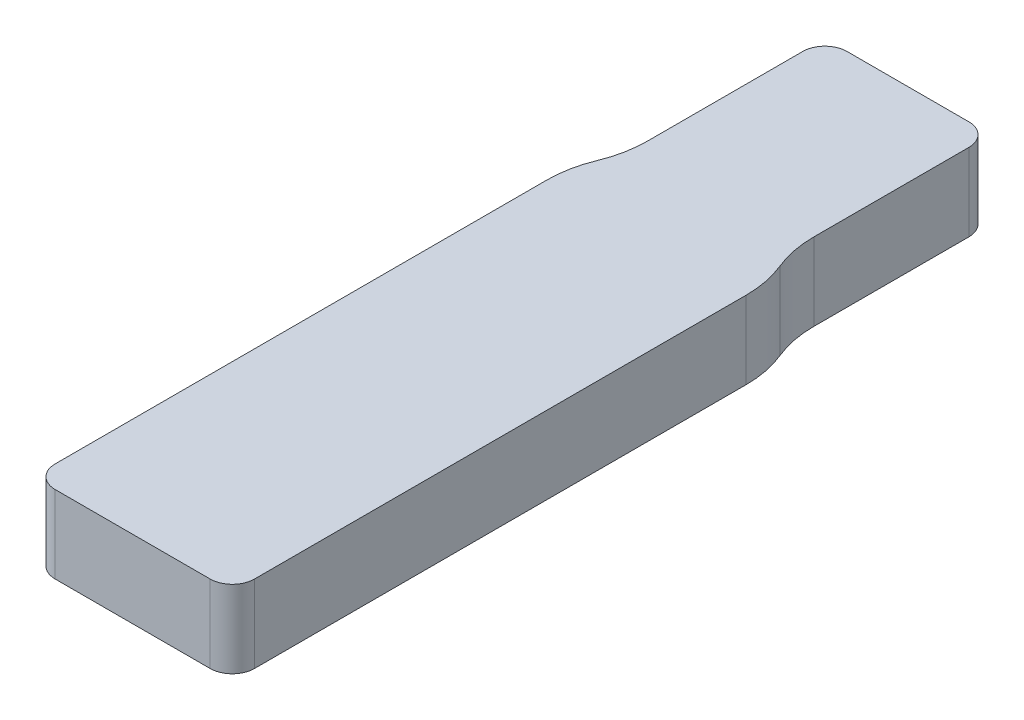
ISO-10303-21;
HEADER;
FILE_DESCRIPTION(('STEP AP214'),'2;1');
FILE_NAME('part.step','',(''),(''),'','','');
FILE_SCHEMA(('AUTOMOTIVE_DESIGN { 1 0 10303 214 1 1 1 1 }'));
ENDSEC;
DATA;
#1=APPLICATION_CONTEXT('core data for automotive mechanical design processes');
#2=APPLICATION_PROTOCOL_DEFINITION('international standard','automotive_design',2000,#1);
#3=PRODUCT_CONTEXT('',#1,'mechanical');
#4=PRODUCT('Part','Part','',(#3));
#5=PRODUCT_RELATED_PRODUCT_CATEGORY('part','',(#4));
#6=PRODUCT_DEFINITION_FORMATION('','',#4);
#7=PRODUCT_DEFINITION_CONTEXT('part definition',#1,'design');
#8=PRODUCT_DEFINITION('design','',#6,#7);
#9=PRODUCT_DEFINITION_SHAPE('','',#8);
#10=(LENGTH_UNIT() NAMED_UNIT(*) SI_UNIT(.MILLI.,.METRE.));
#11=(NAMED_UNIT(*) PLANE_ANGLE_UNIT() SI_UNIT($,.RADIAN.));
#12=(NAMED_UNIT(*) SI_UNIT($,.STERADIAN.) SOLID_ANGLE_UNIT());
#13=UNCERTAINTY_MEASURE_WITH_UNIT(LENGTH_MEASURE(1.E-05),#10,'distance_accuracy_value','');
#14=(GEOMETRIC_REPRESENTATION_CONTEXT(3) GLOBAL_UNCERTAINTY_ASSIGNED_CONTEXT((#13)) GLOBAL_UNIT_ASSIGNED_CONTEXT((#10,
#11,#12)) REPRESENTATION_CONTEXT('',''));
#15=CARTESIAN_POINT('',(0.,0.,0.));
#16=DIRECTION('',(0.,0.,1.));
#17=DIRECTION('',(1.,0.,0.));
#18=AXIS2_PLACEMENT_3D('',#15,#16,#17);
#19=CARTESIAN_POINT('',(0.,7.,0.));
#20=DIRECTION('',(0.,0.,-1.));
#21=DIRECTION('',(-1.,0.,0.));
#22=AXIS2_PLACEMENT_3D('',#19,#20,#21);
#23=PLANE('',#22);
#24=DIRECTION('',(1.,0.,0.));
#25=VECTOR('',#24,1.);
#26=CARTESIAN_POINT('',(0.,0.,0.));
#27=LINE('',#26,#25);
#28=CARTESIAN_POINT('',(-7.,0.,0.));
#29=VERTEX_POINT('',#28);
#30=CARTESIAN_POINT('',(7.,0.,0.));
#31=VERTEX_POINT('',#30);
#32=EDGE_CURVE('E104',#29,#31,#27,.T.);
#33=ORIENTED_EDGE('',*,*,#32,.T.);
#34=DIRECTION('',(0.,-1.,0.));
#35=VECTOR('',#34,1.);
#36=CARTESIAN_POINT('',(7.,7.,0.));
#37=LINE('',#36,#35);
#38=CARTESIAN_POINT('',(7.,7.,0.));
#39=VERTEX_POINT('',#38);
#40=EDGE_CURVE('E11',#39,#31,#37,.T.);
#41=ORIENTED_EDGE('',*,*,#40,.F.);
#42=DIRECTION('',(1.,0.,0.));
#43=VECTOR('',#42,1.);
#44=CARTESIAN_POINT('',(0.,7.,0.));
#45=LINE('',#44,#43);
#46=CARTESIAN_POINT('',(-7.,7.,0.));
#47=VERTEX_POINT('',#46);
#48=EDGE_CURVE('E110',#47,#39,#45,.T.);
#49=ORIENTED_EDGE('',*,*,#48,.F.);
#50=DIRECTION('',(0.,-1.,0.));
#51=VECTOR('',#50,1.);
#52=CARTESIAN_POINT('',(-7.,7.,0.));
#53=LINE('',#52,#51);
#54=EDGE_CURVE('E162',#47,#29,#53,.T.);
#55=ORIENTED_EDGE('',*,*,#54,.T.);
#56=EDGE_LOOP('',(#33,#41,#49,#55));
#57=FACE_BOUND('',#56,.T.);
#58=ADVANCED_FACE('F34',(#57),#23,.F.);
#59=CARTESIAN_POINT('',(7.,7.,-2.));
#60=DIRECTION('',(0.,-1.,0.));
#61=DIRECTION('',(0.,0.,-1.));
#62=AXIS2_PLACEMENT_3D('',#59,#60,#61);
#63=CYLINDRICAL_SURFACE('',#62,2.);
#64=CARTESIAN_POINT('',(7.,0.,-2.));
#65=DIRECTION('',(0.,1.,0.));
#66=DIRECTION('',(0.,0.,1.));
#67=AXIS2_PLACEMENT_3D('',#64,#65,#66);
#68=CIRCLE('',#67,2.);
#69=CARTESIAN_POINT('',(9.,0.,-2.));
#70=VERTEX_POINT('',#69);
#71=EDGE_CURVE('E167',#31,#70,#68,.T.);
#72=ORIENTED_EDGE('',*,*,#71,.T.);
#73=DIRECTION('',(0.,-1.,0.));
#74=VECTOR('',#73,1.);
#75=CARTESIAN_POINT('',(9.,7.,-2.));
#76=LINE('',#75,#74);
#77=CARTESIAN_POINT('',(9.,7.,-2.));
#78=VERTEX_POINT('',#77);
#79=EDGE_CURVE('E42',#78,#70,#76,.T.);
#80=ORIENTED_EDGE('',*,*,#79,.F.);
#81=CARTESIAN_POINT('',(7.,7.,-2.));
#82=DIRECTION('',(0.,1.,0.));
#83=DIRECTION('',(0.,0.,1.));
#84=AXIS2_PLACEMENT_3D('',#81,#82,#83);
#85=CIRCLE('',#84,2.);
#86=EDGE_CURVE('E270',#39,#78,#85,.T.);
#87=ORIENTED_EDGE('',*,*,#86,.F.);
#88=ORIENTED_EDGE('',*,*,#40,.T.);
#89=EDGE_LOOP('',(#72,#80,#87,#88));
#90=FACE_BOUND('',#89,.T.);
#91=ADVANCED_FACE('F273',(#90),#63,.T.);
#92=CARTESIAN_POINT('',(9.,7.,-2.));
#93=DIRECTION('',(-1.,0.,0.));
#94=DIRECTION('',(0.,0.,1.));
#95=AXIS2_PLACEMENT_3D('',#92,#93,#94);
#96=PLANE('',#95);
#97=DIRECTION('',(0.,0.,-1.));
#98=VECTOR('',#97,1.);
#99=CARTESIAN_POINT('',(9.,0.,-2.));
#100=LINE('',#99,#98);
#101=CARTESIAN_POINT('',(9.,0.,-46.39280404));
#102=VERTEX_POINT('',#101);
#103=EDGE_CURVE('E169',#70,#102,#100,.T.);
#104=ORIENTED_EDGE('',*,*,#103,.T.);
#105=DIRECTION('',(0.,-1.,0.));
#106=VECTOR('',#105,1.);
#107=CARTESIAN_POINT('',(9.,7.,-46.39280404));
#108=LINE('',#107,#106);
#109=CARTESIAN_POINT('',(9.,7.,-46.39280404));
#110=VERTEX_POINT('',#109);
#111=EDGE_CURVE('E217',#110,#102,#108,.T.);
#112=ORIENTED_EDGE('',*,*,#111,.F.);
#113=DIRECTION('',(0.,0.,-1.));
#114=VECTOR('',#113,1.);
#115=CARTESIAN_POINT('',(9.,7.,-2.));
#116=LINE('',#115,#114);
#117=EDGE_CURVE('E226',#78,#110,#116,.T.);
#118=ORIENTED_EDGE('',*,*,#117,.F.);
#119=ORIENTED_EDGE('',*,*,#79,.T.);
#120=EDGE_LOOP('',(#104,#112,#118,#119));
#121=FACE_BOUND('',#120,.T.);
#122=ADVANCED_FACE('F224',(#121),#96,.F.);
#123=CARTESIAN_POINT('',(-1.,7.,-46.3928040399999));
#124=DIRECTION('',(0.,-1.,0.));
#125=DIRECTION('',(0.,0.,-1.));
#126=AXIS2_PLACEMENT_3D('',#123,#124,#125);
#127=CYLINDRICAL_SURFACE('',#126,10.);
#128=CARTESIAN_POINT('',(-1.,0.,-46.3928040399999));
#129=DIRECTION('',(0.,1.,0.));
#130=DIRECTION('',(0.,0.,1.));
#131=AXIS2_PLACEMENT_3D('',#128,#129,#130);
#132=CIRCLE('',#131,10.);
#133=CARTESIAN_POINT('',(8.25148991357196,0.,-50.1888459758952));
#134=VERTEX_POINT('',#133);
#135=EDGE_CURVE('E171',#102,#134,#132,.T.);
#136=ORIENTED_EDGE('',*,*,#135,.T.);
#137=DIRECTION('',(0.,-1.,0.));
#138=VECTOR('',#137,1.);
#139=CARTESIAN_POINT('',(8.25148991357196,7.,-50.1888459758952));
#140=LINE('',#139,#138);
#141=CARTESIAN_POINT('',(8.25148991357196,7.,-50.1888459758952));
#142=VERTEX_POINT('',#141);
#143=EDGE_CURVE('E214',#142,#134,#140,.T.);
#144=ORIENTED_EDGE('',*,*,#143,.F.);
#145=CARTESIAN_POINT('',(-1.,7.,-46.3928040399999));
#146=DIRECTION('',(0.,1.,0.));
#147=DIRECTION('',(0.,0.,1.));
#148=AXIS2_PLACEMENT_3D('',#145,#146,#147);
#149=CIRCLE('',#148,10.);
#150=EDGE_CURVE('E244',#110,#142,#149,.T.);
#151=ORIENTED_EDGE('',*,*,#150,.F.);
#152=ORIENTED_EDGE('',*,*,#111,.T.);
#153=EDGE_LOOP('',(#136,#144,#151,#152));
#154=FACE_BOUND('',#153,.T.);
#155=ADVANCED_FACE('F235',(#154),#127,.T.);
#156=CARTESIAN_POINT('',(17.539810113425,7.,-53.999999997794));
#157=DIRECTION('',(0.,-1.,0.));
#158=DIRECTION('',(0.,0.,-1.));
#159=AXIS2_PLACEMENT_3D('',#156,#157,#158);
#160=CYLINDRICAL_SURFACE('',#159,10.0398101134251);
#161=CARTESIAN_POINT('',(17.539810113425,0.,-53.999999997794));
#162=DIRECTION('',(0.,-1.,0.));
#163=DIRECTION('',(0.,0.,1.));
#164=AXIS2_PLACEMENT_3D('',#161,#162,#163);
#165=CIRCLE('',#164,10.0398101134251);
#166=CARTESIAN_POINT('',(7.49999999999988,0.,-53.9999999977944));
#167=VERTEX_POINT('',#166);
#168=EDGE_CURVE('E173',#134,#167,#165,.T.);
#169=ORIENTED_EDGE('',*,*,#168,.T.);
#170=DIRECTION('',(0.,-1.,0.));
#171=VECTOR('',#170,1.);
#172=CARTESIAN_POINT('',(7.49999999999988,7.,-53.9999999977944));
#173=LINE('',#172,#171);
#174=CARTESIAN_POINT('',(7.49999999999988,7.,-53.9999999977944));
#175=VERTEX_POINT('',#174);
#176=EDGE_CURVE('E211',#175,#167,#173,.T.);
#177=ORIENTED_EDGE('',*,*,#176,.F.);
#178=CARTESIAN_POINT('',(17.539810113425,7.,-53.999999997794));
#179=DIRECTION('',(0.,-1.,0.));
#180=DIRECTION('',(0.,0.,1.));
#181=AXIS2_PLACEMENT_3D('',#178,#179,#180);
#182=CIRCLE('',#181,10.0398101134251);
#183=EDGE_CURVE('E241',#142,#175,#182,.T.);
#184=ORIENTED_EDGE('',*,*,#183,.F.);
#185=ORIENTED_EDGE('',*,*,#143,.T.);
#186=EDGE_LOOP('',(#169,#177,#184,#185));
#187=FACE_BOUND('',#186,.T.);
#188=ADVANCED_FACE('F239',(#187),#160,.F.);
#189=CARTESIAN_POINT('',(7.49999999999988,7.,-67.9999999977944));
#190=DIRECTION('',(-1.,0.,0.));
#191=DIRECTION('',(0.,0.,1.));
#192=AXIS2_PLACEMENT_3D('',#189,#190,#191);
#193=PLANE('',#192);
#194=DIRECTION('',(0.,0.,-1.));
#195=VECTOR('',#194,1.);
#196=CARTESIAN_POINT('',(7.49999999999988,0.,-67.9999999977944));
#197=LINE('',#196,#195);
#198=CARTESIAN_POINT('',(7.49999999999988,0.,-67.9999999977944));
#199=VERTEX_POINT('',#198);
#200=EDGE_CURVE('E175',#167,#199,#197,.T.);
#201=ORIENTED_EDGE('',*,*,#200,.T.);
#202=DIRECTION('',(0.,-1.,0.));
#203=VECTOR('',#202,1.);
#204=CARTESIAN_POINT('',(7.49999999999988,7.,-67.9999999977944));
#205=LINE('',#204,#203);
#206=CARTESIAN_POINT('',(7.49999999999988,7.,-67.9999999977944));
#207=VERTEX_POINT('',#206);
#208=EDGE_CURVE('E208',#207,#199,#205,.T.);
#209=ORIENTED_EDGE('',*,*,#208,.F.);
#210=DIRECTION('',(0.,0.,-1.));
#211=VECTOR('',#210,1.);
#212=CARTESIAN_POINT('',(7.49999999999988,7.,-67.9999999977944));
#213=LINE('',#212,#211);
#214=EDGE_CURVE('E243',#175,#207,#213,.T.);
#215=ORIENTED_EDGE('',*,*,#214,.F.);
#216=ORIENTED_EDGE('',*,*,#176,.T.);
#217=EDGE_LOOP('',(#201,#209,#215,#216));
#218=FACE_BOUND('',#217,.T.);
#219=ADVANCED_FACE('F285',(#218),#193,.F.);
#220=CARTESIAN_POINT('',(5.49999999999988,7.,-67.9999999977944));
#221=DIRECTION('',(0.,-1.,0.));
#222=DIRECTION('',(0.,0.,-1.));
#223=AXIS2_PLACEMENT_3D('',#220,#221,#222);
#224=CYLINDRICAL_SURFACE('',#223,2.);
#225=CARTESIAN_POINT('',(5.49999999999988,0.,-67.9999999977944));
#226=DIRECTION('',(0.,1.,0.));
#227=DIRECTION('',(0.,0.,1.));
#228=AXIS2_PLACEMENT_3D('',#225,#226,#227);
#229=CIRCLE('',#228,2.);
#230=CARTESIAN_POINT('',(5.49999999999988,0.,-69.9999999977944));
#231=VERTEX_POINT('',#230);
#232=EDGE_CURVE('E177',#199,#231,#229,.T.);
#233=ORIENTED_EDGE('',*,*,#232,.T.);
#234=DIRECTION('',(0.,-1.,0.));
#235=VECTOR('',#234,1.);
#236=CARTESIAN_POINT('',(5.49999999999988,7.,-69.9999999977944));
#237=LINE('',#236,#235);
#238=CARTESIAN_POINT('',(5.49999999999988,7.,-69.9999999977944));
#239=VERTEX_POINT('',#238);
#240=EDGE_CURVE('E205',#239,#231,#237,.T.);
#241=ORIENTED_EDGE('',*,*,#240,.F.);
#242=CARTESIAN_POINT('',(5.49999999999988,7.,-67.9999999977944));
#243=DIRECTION('',(0.,1.,0.));
#244=DIRECTION('',(0.,0.,1.));
#245=AXIS2_PLACEMENT_3D('',#242,#243,#244);
#246=CIRCLE('',#245,2.);
#247=EDGE_CURVE('E246',#207,#239,#246,.T.);
#248=ORIENTED_EDGE('',*,*,#247,.F.);
#249=ORIENTED_EDGE('',*,*,#208,.T.);
#250=EDGE_LOOP('',(#233,#241,#248,#249));
#251=FACE_BOUND('',#250,.T.);
#252=ADVANCED_FACE('F288',(#251),#224,.T.);
#253=CARTESIAN_POINT('',(-1.16696113652935E-13,7.,-69.9999999977944));
#254=DIRECTION('',(0.,0.,1.));
#255=DIRECTION('',(1.,0.,0.));
#256=AXIS2_PLACEMENT_3D('',#253,#254,#255);
#257=PLANE('',#256);
#258=DIRECTION('',(-1.,0.,0.));
#259=VECTOR('',#258,1.);
#260=CARTESIAN_POINT('',(-1.16696113652935E-13,0.,-69.9999999977944));
#261=LINE('',#260,#259);
#262=CARTESIAN_POINT('',(-5.50000000000012,0.,-69.9999999977944));
#263=VERTEX_POINT('',#262);
#264=EDGE_CURVE('E180',#231,#263,#261,.T.);
#265=ORIENTED_EDGE('',*,*,#264,.T.);
#266=DIRECTION('',(0.,-1.,0.));
#267=VECTOR('',#266,1.);
#268=CARTESIAN_POINT('',(-5.50000000000012,7.,-69.9999999977944));
#269=LINE('',#268,#267);
#270=CARTESIAN_POINT('',(-5.50000000000012,7.,-69.9999999977944));
#271=VERTEX_POINT('',#270);
#272=EDGE_CURVE('E202',#271,#263,#269,.T.);
#273=ORIENTED_EDGE('',*,*,#272,.F.);
#274=DIRECTION('',(-1.,0.,0.));
#275=VECTOR('',#274,1.);
#276=CARTESIAN_POINT('',(-1.16696113652935E-13,7.,-69.9999999977944));
#277=LINE('',#276,#275);
#278=EDGE_CURVE('E252',#239,#271,#277,.T.);
#279=ORIENTED_EDGE('',*,*,#278,.F.);
#280=ORIENTED_EDGE('',*,*,#240,.T.);
#281=EDGE_LOOP('',(#265,#273,#279,#280));
#282=FACE_BOUND('',#281,.T.);
#283=ADVANCED_FACE('F292',(#282),#257,.F.);
#284=CARTESIAN_POINT('',(-5.50000000000011,7.,-67.9999999977944));
#285=DIRECTION('',(0.,-1.,0.));
#286=DIRECTION('',(0.,0.,-1.));
#287=AXIS2_PLACEMENT_3D('',#284,#285,#286);
#288=CYLINDRICAL_SURFACE('',#287,2.);
#289=CARTESIAN_POINT('',(-5.50000000000011,0.,-67.9999999977944));
#290=DIRECTION('',(0.,1.,0.));
#291=DIRECTION('',(0.,0.,1.));
#292=AXIS2_PLACEMENT_3D('',#289,#290,#291);
#293=CIRCLE('',#292,2.);
#294=CARTESIAN_POINT('',(-7.50000000000011,0.,-67.9999999977944));
#295=VERTEX_POINT('',#294);
#296=EDGE_CURVE('E182',#263,#295,#293,.T.);
#297=ORIENTED_EDGE('',*,*,#296,.T.);
#298=DIRECTION('',(0.,-1.,0.));
#299=VECTOR('',#298,1.);
#300=CARTESIAN_POINT('',(-7.50000000000011,7.,-67.9999999977944));
#301=LINE('',#300,#299);
#302=CARTESIAN_POINT('',(-7.50000000000011,7.,-67.9999999977944));
#303=VERTEX_POINT('',#302);
#304=EDGE_CURVE('E199',#303,#295,#301,.T.);
#305=ORIENTED_EDGE('',*,*,#304,.F.);
#306=CARTESIAN_POINT('',(-5.50000000000011,7.,-67.9999999977944));
#307=DIRECTION('',(0.,1.,0.));
#308=DIRECTION('',(0.,0.,1.));
#309=AXIS2_PLACEMENT_3D('',#306,#307,#308);
#310=CIRCLE('',#309,2.);
#311=EDGE_CURVE('E254',#271,#303,#310,.T.);
#312=ORIENTED_EDGE('',*,*,#311,.F.);
#313=ORIENTED_EDGE('',*,*,#272,.T.);
#314=EDGE_LOOP('',(#297,#305,#312,#313));
#315=FACE_BOUND('',#314,.T.);
#316=ADVANCED_FACE('F296',(#315),#288,.T.);
#317=CARTESIAN_POINT('',(-7.50000000000011,7.,-67.9999999977944));
#318=DIRECTION('',(1.,0.,0.));
#319=DIRECTION('',(0.,0.,-1.));
#320=AXIS2_PLACEMENT_3D('',#317,#318,#319);
#321=PLANE('',#320);
#322=DIRECTION('',(0.,0.,1.));
#323=VECTOR('',#322,1.);
#324=CARTESIAN_POINT('',(-7.50000000000011,0.,-67.9999999977944));
#325=LINE('',#324,#323);
#326=CARTESIAN_POINT('',(-7.50000000000011,0.,-53.9999999977944));
#327=VERTEX_POINT('',#326);
#328=EDGE_CURVE('E184',#295,#327,#325,.T.);
#329=ORIENTED_EDGE('',*,*,#328,.T.);
#330=DIRECTION('',(0.,-1.,0.));
#331=VECTOR('',#330,1.);
#332=CARTESIAN_POINT('',(-7.50000000000011,7.,-53.9999999977944));
#333=LINE('',#332,#331);
#334=CARTESIAN_POINT('',(-7.50000000000011,7.,-53.9999999977944));
#335=VERTEX_POINT('',#334);
#336=EDGE_CURVE('E196',#335,#327,#333,.T.);
#337=ORIENTED_EDGE('',*,*,#336,.F.);
#338=DIRECTION('',(0.,0.,1.));
#339=VECTOR('',#338,1.);
#340=CARTESIAN_POINT('',(-7.50000000000011,7.,-67.9999999977944));
#341=LINE('',#340,#339);
#342=EDGE_CURVE('E256',#303,#335,#341,.T.);
#343=ORIENTED_EDGE('',*,*,#342,.F.);
#344=ORIENTED_EDGE('',*,*,#304,.T.);
#345=EDGE_LOOP('',(#329,#337,#343,#344));
#346=FACE_BOUND('',#345,.T.);
#347=ADVANCED_FACE('F262',(#346),#321,.F.);
#348=CARTESIAN_POINT('',(-17.5398101134252,7.,-53.9999999977944));
#349=DIRECTION('',(0.,-1.,0.));
#350=DIRECTION('',(0.,0.,-1.));
#351=AXIS2_PLACEMENT_3D('',#348,#349,#350);
#352=CYLINDRICAL_SURFACE('',#351,10.0398101134251);
#353=CARTESIAN_POINT('',(-17.5398101134252,0.,-53.9999999977944));
#354=DIRECTION('',(0.,-1.,0.));
#355=DIRECTION('',(0.,0.,1.));
#356=AXIS2_PLACEMENT_3D('',#353,#354,#355);
#357=CIRCLE('',#356,10.0398101134251);
#358=CARTESIAN_POINT('',(-8.25148991357215,0.,-50.1888459758958));
#359=VERTEX_POINT('',#358);
#360=EDGE_CURVE('E186',#327,#359,#357,.T.);
#361=ORIENTED_EDGE('',*,*,#360,.T.);
#362=DIRECTION('',(0.,-1.,0.));
#363=VECTOR('',#362,1.);
#364=CARTESIAN_POINT('',(-8.25148991357215,7.,-50.1888459758958));
#365=LINE('',#364,#363);
#366=CARTESIAN_POINT('',(-8.25148991357215,7.,-50.1888459758958));
#367=VERTEX_POINT('',#366);
#368=EDGE_CURVE('E157',#367,#359,#365,.T.);
#369=ORIENTED_EDGE('',*,*,#368,.F.);
#370=CARTESIAN_POINT('',(-17.5398101134252,7.,-53.9999999977944));
#371=DIRECTION('',(0.,-1.,0.));
#372=DIRECTION('',(0.,0.,1.));
#373=AXIS2_PLACEMENT_3D('',#370,#371,#372);
#374=CIRCLE('',#373,10.0398101134251);
#375=EDGE_CURVE('E148',#335,#367,#374,.T.);
#376=ORIENTED_EDGE('',*,*,#375,.F.);
#377=ORIENTED_EDGE('',*,*,#336,.T.);
#378=EDGE_LOOP('',(#361,#369,#376,#377));
#379=FACE_BOUND('',#378,.T.);
#380=ADVANCED_FACE('F266',(#379),#352,.F.);
#381=CARTESIAN_POINT('',(1.,7.,-46.3928040400008));
#382=DIRECTION('',(0.,-1.,0.));
#383=DIRECTION('',(0.,0.,-1.));
#384=AXIS2_PLACEMENT_3D('',#381,#382,#383);
#385=CYLINDRICAL_SURFACE('',#384,10.);
#386=CARTESIAN_POINT('',(1.,0.,-46.3928040400008));
#387=DIRECTION('',(0.,1.,0.));
#388=DIRECTION('',(0.,0.,1.));
#389=AXIS2_PLACEMENT_3D('',#386,#387,#388);
#390=CIRCLE('',#389,10.);
#391=CARTESIAN_POINT('',(-9.,0.,-46.39280404));
#392=VERTEX_POINT('',#391);
#393=EDGE_CURVE('E156',#359,#392,#390,.T.);
#394=ORIENTED_EDGE('',*,*,#393,.T.);
#395=DIRECTION('',(0.,-1.,0.));
#396=VECTOR('',#395,1.);
#397=CARTESIAN_POINT('',(-9.,7.,-46.39280404));
#398=LINE('',#397,#396);
#399=CARTESIAN_POINT('',(-9.,7.,-46.39280404));
#400=VERTEX_POINT('',#399);
#401=EDGE_CURVE('E153',#400,#392,#398,.T.);
#402=ORIENTED_EDGE('',*,*,#401,.F.);
#403=CARTESIAN_POINT('',(1.,7.,-46.3928040400008));
#404=DIRECTION('',(0.,1.,0.));
#405=DIRECTION('',(0.,0.,1.));
#406=AXIS2_PLACEMENT_3D('',#403,#404,#405);
#407=CIRCLE('',#406,10.);
#408=EDGE_CURVE('E142',#367,#400,#407,.T.);
#409=ORIENTED_EDGE('',*,*,#408,.F.);
#410=ORIENTED_EDGE('',*,*,#368,.T.);
#411=EDGE_LOOP('',(#394,#402,#409,#410));
#412=FACE_BOUND('',#411,.T.);
#413=ADVANCED_FACE('F154',(#412),#385,.T.);
#414=CARTESIAN_POINT('',(-9.,7.,-2.));
#415=DIRECTION('',(1.,0.,0.));
#416=DIRECTION('',(0.,0.,-1.));
#417=AXIS2_PLACEMENT_3D('',#414,#415,#416);
#418=PLANE('',#417);
#419=DIRECTION('',(0.,0.,1.));
#420=VECTOR('',#419,1.);
#421=CARTESIAN_POINT('',(-9.,0.,-2.));
#422=LINE('',#421,#420);
#423=CARTESIAN_POINT('',(-9.,0.,-2.));
#424=VERTEX_POINT('',#423);
#425=EDGE_CURVE('E97',#392,#424,#422,.T.);
#426=ORIENTED_EDGE('',*,*,#425,.T.);
#427=DIRECTION('',(0.,-1.,0.));
#428=VECTOR('',#427,1.);
#429=CARTESIAN_POINT('',(-9.,7.,-2.));
#430=LINE('',#429,#428);
#431=CARTESIAN_POINT('',(-9.,7.,-2.));
#432=VERTEX_POINT('',#431);
#433=EDGE_CURVE('E158',#432,#424,#430,.T.);
#434=ORIENTED_EDGE('',*,*,#433,.F.);
#435=DIRECTION('',(0.,0.,1.));
#436=VECTOR('',#435,1.);
#437=CARTESIAN_POINT('',(-9.,7.,-2.));
#438=LINE('',#437,#436);
#439=EDGE_CURVE('E146',#400,#432,#438,.T.);
#440=ORIENTED_EDGE('',*,*,#439,.F.);
#441=ORIENTED_EDGE('',*,*,#401,.T.);
#442=EDGE_LOOP('',(#426,#434,#440,#441));
#443=FACE_BOUND('',#442,.T.);
#444=ADVANCED_FACE('F160',(#443),#418,.F.);
#445=CARTESIAN_POINT('',(-7.,7.,-2.));
#446=DIRECTION('',(0.,-1.,0.));
#447=DIRECTION('',(0.,0.,-1.));
#448=AXIS2_PLACEMENT_3D('',#445,#446,#447);
#449=CYLINDRICAL_SURFACE('',#448,2.);
#450=CARTESIAN_POINT('',(-7.,0.,-2.));
#451=DIRECTION('',(0.,1.,0.));
#452=DIRECTION('',(0.,0.,1.));
#453=AXIS2_PLACEMENT_3D('',#450,#451,#452);
#454=CIRCLE('',#453,2.);
#455=EDGE_CURVE('E190',#424,#29,#454,.T.);
#456=ORIENTED_EDGE('',*,*,#455,.T.);
#457=ORIENTED_EDGE('',*,*,#54,.F.);
#458=CARTESIAN_POINT('',(-7.,7.,-2.));
#459=DIRECTION('',(0.,1.,0.));
#460=DIRECTION('',(0.,0.,1.));
#461=AXIS2_PLACEMENT_3D('',#458,#459,#460);
#462=CIRCLE('',#461,2.);
#463=EDGE_CURVE('E50',#432,#47,#462,.T.);
#464=ORIENTED_EDGE('',*,*,#463,.F.);
#465=ORIENTED_EDGE('',*,*,#433,.T.);
#466=EDGE_LOOP('',(#456,#457,#464,#465));
#467=FACE_BOUND('',#466,.T.);
#468=ADVANCED_FACE('F268',(#467),#449,.T.);
#469=CARTESIAN_POINT('',(-7.,7.,-2.));
#470=DIRECTION('',(0.,1.,0.));
#471=DIRECTION('',(0.,0.,1.));
#472=AXIS2_PLACEMENT_3D('',#469,#470,#471);
#473=PLANE('',#472);
#474=ORIENTED_EDGE('',*,*,#48,.T.);
#475=ORIENTED_EDGE('',*,*,#86,.T.);
#476=ORIENTED_EDGE('',*,*,#117,.T.);
#477=ORIENTED_EDGE('',*,*,#150,.T.);
#478=ORIENTED_EDGE('',*,*,#183,.T.);
#479=ORIENTED_EDGE('',*,*,#214,.T.);
#480=ORIENTED_EDGE('',*,*,#247,.T.);
#481=ORIENTED_EDGE('',*,*,#278,.T.);
#482=ORIENTED_EDGE('',*,*,#311,.T.);
#483=ORIENTED_EDGE('',*,*,#342,.T.);
#484=ORIENTED_EDGE('',*,*,#375,.T.);
#485=ORIENTED_EDGE('',*,*,#408,.T.);
#486=ORIENTED_EDGE('',*,*,#439,.T.);
#487=ORIENTED_EDGE('',*,*,#463,.T.);
#488=EDGE_LOOP('',(#474,#475,#476,#477,#478,#479,#480,#481,#482,#483,#484,#485,#486,#487));
#489=FACE_BOUND('',#488,.T.);
#490=ADVANCED_FACE('F144',(#489),#473,.T.);
#491=CARTESIAN_POINT('',(-7.,0.,-2.));
#492=DIRECTION('',(0.,1.,0.));
#493=DIRECTION('',(0.,0.,1.));
#494=AXIS2_PLACEMENT_3D('',#491,#492,#493);
#495=PLANE('',#494);
#496=ORIENTED_EDGE('',*,*,#32,.F.);
#497=ORIENTED_EDGE('',*,*,#455,.F.);
#498=ORIENTED_EDGE('',*,*,#425,.F.);
#499=ORIENTED_EDGE('',*,*,#393,.F.);
#500=ORIENTED_EDGE('',*,*,#360,.F.);
#501=ORIENTED_EDGE('',*,*,#328,.F.);
#502=ORIENTED_EDGE('',*,*,#296,.F.);
#503=ORIENTED_EDGE('',*,*,#264,.F.);
#504=ORIENTED_EDGE('',*,*,#232,.F.);
#505=ORIENTED_EDGE('',*,*,#200,.F.);
#506=ORIENTED_EDGE('',*,*,#168,.F.);
#507=ORIENTED_EDGE('',*,*,#135,.F.);
#508=ORIENTED_EDGE('',*,*,#103,.F.);
#509=ORIENTED_EDGE('',*,*,#71,.F.);
#510=EDGE_LOOP('',(#496,#497,#498,#499,#500,#501,#502,#503,#504,#505,#506,#507,#508,#509));
#511=FACE_BOUND('',#510,.T.);
#512=ADVANCED_FACE('F230',(#511),#495,.F.);
#513=CLOSED_SHELL('',(#58,#91,#122,#155,#188,#219,#252,#283,#316,#347,#380,#413,#444,#468,#490,#512));
#514=MANIFOLD_SOLID_BREP('B2',#513);
#515=ADVANCED_BREP_SHAPE_REPRESENTATION('',(#18,#514),#14);
#516=SHAPE_DEFINITION_REPRESENTATION(#9,#515);
ENDSEC;
END-ISO-10303-21;
